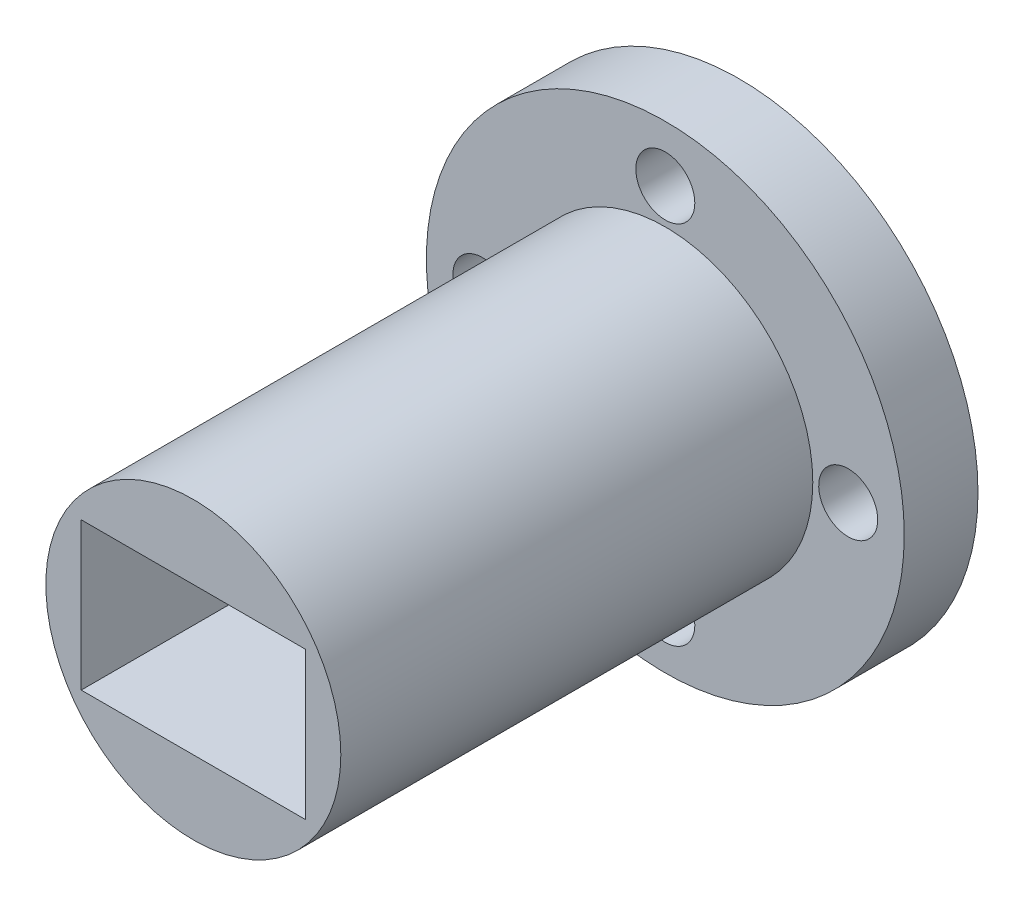
ISO-10303-21;
HEADER;
FILE_DESCRIPTION(('STEP AP214'),'2;1');
FILE_NAME('part.step','',(''),(''),'','','');
FILE_SCHEMA(('AUTOMOTIVE_DESIGN { 1 0 10303 214 1 1 1 1 }'));
ENDSEC;
DATA;
#1=APPLICATION_CONTEXT('core data for automotive mechanical design processes');
#2=APPLICATION_PROTOCOL_DEFINITION('international standard','automotive_design',2000,#1);
#3=PRODUCT_CONTEXT('',#1,'mechanical');
#4=PRODUCT('Part','Part','',(#3));
#5=PRODUCT_RELATED_PRODUCT_CATEGORY('part','',(#4));
#6=PRODUCT_DEFINITION_FORMATION('','',#4);
#7=PRODUCT_DEFINITION_CONTEXT('part definition',#1,'design');
#8=PRODUCT_DEFINITION('design','',#6,#7);
#9=PRODUCT_DEFINITION_SHAPE('','',#8);
#10=(LENGTH_UNIT() NAMED_UNIT(*) SI_UNIT(.MILLI.,.METRE.));
#11=(NAMED_UNIT(*) PLANE_ANGLE_UNIT() SI_UNIT($,.RADIAN.));
#12=(NAMED_UNIT(*) SI_UNIT($,.STERADIAN.) SOLID_ANGLE_UNIT());
#13=UNCERTAINTY_MEASURE_WITH_UNIT(LENGTH_MEASURE(1.E-05),#10,'distance_accuracy_value','');
#14=(GEOMETRIC_REPRESENTATION_CONTEXT(3) GLOBAL_UNCERTAINTY_ASSIGNED_CONTEXT((#13)) GLOBAL_UNIT_ASSIGNED_CONTEXT((#10,
#11,#12)) REPRESENTATION_CONTEXT('',''));
#15=CARTESIAN_POINT('',(0.,0.,0.));
#16=DIRECTION('',(0.,0.,1.));
#17=DIRECTION('',(1.,0.,0.));
#18=AXIS2_PLACEMENT_3D('',#15,#16,#17);
#19=CARTESIAN_POINT('',(0.,0.,3.175));
#20=DIRECTION('',(0.,0.,-1.));
#21=DIRECTION('',(-1.,0.,0.));
#22=AXIS2_PLACEMENT_3D('',#19,#20,#21);
#23=CYLINDRICAL_SURFACE('',#22,10.287);
#24=CARTESIAN_POINT('',(0.,0.,3.175));
#25=DIRECTION('',(0.,0.,1.));
#26=DIRECTION('',(1.,0.,0.));
#27=AXIS2_PLACEMENT_3D('',#24,#25,#26);
#28=CIRCLE('',#27,10.287);
#29=CARTESIAN_POINT('',(10.287,0.,3.175));
#30=VERTEX_POINT('',#29);
#31=EDGE_CURVE('E172',#30,#30,#28,.T.);
#32=ORIENTED_EDGE('',*,*,#31,.F.);
#33=EDGE_LOOP('',(#32));
#34=FACE_BOUND('',#33,.T.);
#35=CARTESIAN_POINT('',(0.,0.,0.));
#36=DIRECTION('',(0.,0.,1.));
#37=DIRECTION('',(1.,0.,0.));
#38=AXIS2_PLACEMENT_3D('',#35,#36,#37);
#39=CIRCLE('',#38,10.287);
#40=CARTESIAN_POINT('',(10.287,0.,0.));
#41=VERTEX_POINT('',#40);
#42=EDGE_CURVE('E171',#41,#41,#39,.T.);
#43=ORIENTED_EDGE('',*,*,#42,.T.);
#44=EDGE_LOOP('',(#43));
#45=FACE_BOUND('',#44,.T.);
#46=ADVANCED_FACE('F39',(#34,#45),#23,.T.);
#47=CARTESIAN_POINT('',(0.,0.,3.175));
#48=DIRECTION('',(0.,0.,1.));
#49=DIRECTION('',(1.,0.,0.));
#50=AXIS2_PLACEMENT_3D('',#47,#48,#49);
#51=PLANE('',#50);
#52=CARTESIAN_POINT('',(0.,0.,3.175));
#53=DIRECTION('',(0.,0.,1.));
#54=DIRECTION('',(1.,0.,0.));
#55=AXIS2_PLACEMENT_3D('',#52,#53,#54);
#56=CIRCLE('',#55,6.35);
#57=CARTESIAN_POINT('',(6.35,0.,3.175));
#58=VERTEX_POINT('',#57);
#59=EDGE_CURVE('E11',#58,#58,#56,.T.);
#60=ORIENTED_EDGE('',*,*,#59,.F.);
#61=EDGE_LOOP('',(#60));
#62=FACE_BOUND('',#61,.T.);
#63=CARTESIAN_POINT('',(7.874,0.,3.175));
#64=DIRECTION('',(0.,0.,1.));
#65=DIRECTION('',(1.,0.,0.));
#66=AXIS2_PLACEMENT_3D('',#63,#64,#65);
#67=CIRCLE('',#66,1.27);
#68=CARTESIAN_POINT('',(9.144,0.,3.175));
#69=VERTEX_POINT('',#68);
#70=EDGE_CURVE('E141',#69,#69,#67,.F.);
#71=ORIENTED_EDGE('',*,*,#70,.T.);
#72=EDGE_LOOP('',(#71));
#73=FACE_BOUND('',#72,.T.);
#74=CARTESIAN_POINT('',(0.,-7.874,3.175));
#75=DIRECTION('',(0.,0.,1.));
#76=DIRECTION('',(1.,0.,0.));
#77=AXIS2_PLACEMENT_3D('',#74,#75,#76);
#78=CIRCLE('',#77,1.27);
#79=CARTESIAN_POINT('',(1.27,-7.874,3.175));
#80=VERTEX_POINT('',#79);
#81=EDGE_CURVE('E149',#80,#80,#78,.F.);
#82=ORIENTED_EDGE('',*,*,#81,.T.);
#83=EDGE_LOOP('',(#82));
#84=FACE_BOUND('',#83,.T.);
#85=CARTESIAN_POINT('',(-7.874,0.,3.175));
#86=DIRECTION('',(0.,0.,1.));
#87=DIRECTION('',(1.,0.,0.));
#88=AXIS2_PLACEMENT_3D('',#85,#86,#87);
#89=CIRCLE('',#88,1.27);
#90=CARTESIAN_POINT('',(-6.604,0.,3.175));
#91=VERTEX_POINT('',#90);
#92=EDGE_CURVE('E134',#91,#91,#89,.F.);
#93=ORIENTED_EDGE('',*,*,#92,.T.);
#94=EDGE_LOOP('',(#93));
#95=FACE_BOUND('',#94,.T.);
#96=CARTESIAN_POINT('',(0.,7.874,3.175));
#97=DIRECTION('',(0.,0.,1.));
#98=DIRECTION('',(1.,0.,0.));
#99=AXIS2_PLACEMENT_3D('',#96,#97,#98);
#100=CIRCLE('',#99,1.27);
#101=CARTESIAN_POINT('',(1.27,7.874,3.175));
#102=VERTEX_POINT('',#101);
#103=EDGE_CURVE('E140',#102,#102,#100,.F.);
#104=ORIENTED_EDGE('',*,*,#103,.T.);
#105=EDGE_LOOP('',(#104));
#106=FACE_BOUND('',#105,.T.);
#107=ORIENTED_EDGE('',*,*,#31,.T.);
#108=EDGE_LOOP('',(#107));
#109=FACE_BOUND('',#108,.T.);
#110=ADVANCED_FACE('F205',(#62,#73,#84,#95,#106,#109),#51,.T.);
#111=CARTESIAN_POINT('',(0.,0.,0.));
#112=DIRECTION('',(0.,0.,1.));
#113=DIRECTION('',(1.,0.,0.));
#114=AXIS2_PLACEMENT_3D('',#111,#112,#113);
#115=PLANE('',#114);
#116=CARTESIAN_POINT('',(7.874,0.,0.));
#117=DIRECTION('',(0.,0.,-1.));
#118=DIRECTION('',(0.,1.,0.));
#119=AXIS2_PLACEMENT_3D('',#116,#117,#118);
#120=CIRCLE('',#119,1.27);
#121=CARTESIAN_POINT('',(7.874,1.26999999999997,0.));
#122=VERTEX_POINT('',#121);
#123=EDGE_CURVE('E136',#122,#122,#120,.T.);
#124=ORIENTED_EDGE('',*,*,#123,.F.);
#125=EDGE_LOOP('',(#124));
#126=FACE_BOUND('',#125,.T.);
#127=CARTESIAN_POINT('',(0.,-7.874,0.));
#128=DIRECTION('',(0.,0.,-1.));
#129=DIRECTION('',(1.,0.,0.));
#130=AXIS2_PLACEMENT_3D('',#127,#128,#129);
#131=CIRCLE('',#130,1.27);
#132=CARTESIAN_POINT('',(1.27,-7.874,0.));
#133=VERTEX_POINT('',#132);
#134=EDGE_CURVE('E145',#133,#133,#131,.T.);
#135=ORIENTED_EDGE('',*,*,#134,.F.);
#136=EDGE_LOOP('',(#135));
#137=FACE_BOUND('',#136,.T.);
#138=CARTESIAN_POINT('',(-7.874,0.,0.));
#139=DIRECTION('',(0.,0.,-1.));
#140=DIRECTION('',(0.,-1.,0.));
#141=AXIS2_PLACEMENT_3D('',#138,#139,#140);
#142=CIRCLE('',#141,1.27);
#143=CARTESIAN_POINT('',(-7.87400000000001,-1.26999999999992,0.));
#144=VERTEX_POINT('',#143);
#145=EDGE_CURVE('E153',#144,#144,#142,.T.);
#146=ORIENTED_EDGE('',*,*,#145,.F.);
#147=EDGE_LOOP('',(#146));
#148=FACE_BOUND('',#147,.T.);
#149=CARTESIAN_POINT('',(0.,7.874,0.));
#150=DIRECTION('',(0.,0.,-1.));
#151=DIRECTION('',(-1.,0.,0.));
#152=AXIS2_PLACEMENT_3D('',#149,#150,#151);
#153=CIRCLE('',#152,1.27);
#154=CARTESIAN_POINT('',(-1.27,7.874,0.));
#155=VERTEX_POINT('',#154);
#156=EDGE_CURVE('E160',#155,#155,#153,.T.);
#157=ORIENTED_EDGE('',*,*,#156,.F.);
#158=EDGE_LOOP('',(#157));
#159=FACE_BOUND('',#158,.T.);
#160=CARTESIAN_POINT('',(0.,0.,0.));
#161=DIRECTION('',(0.,0.,1.));
#162=DIRECTION('',(1.,0.,0.));
#163=AXIS2_PLACEMENT_3D('',#160,#161,#162);
#164=CIRCLE('',#163,5.064000032);
#165=CARTESIAN_POINT('',(5.064000032,0.,0.));
#166=VERTEX_POINT('',#165);
#167=EDGE_CURVE('E43',#166,#166,#164,.T.);
#168=ORIENTED_EDGE('',*,*,#167,.T.);
#169=EDGE_LOOP('',(#168));
#170=FACE_BOUND('',#169,.T.);
#171=ORIENTED_EDGE('',*,*,#42,.F.);
#172=EDGE_LOOP('',(#171));
#173=FACE_BOUND('',#172,.T.);
#174=ADVANCED_FACE('F187',(#126,#137,#148,#159,#170,#173),#115,.F.);
#175=CARTESIAN_POINT('',(0.,0.,2.38125));
#176=DIRECTION('',(0.,0.,-1.));
#177=DIRECTION('',(-1.,0.,0.));
#178=AXIS2_PLACEMENT_3D('',#175,#176,#177);
#179=CYLINDRICAL_SURFACE('',#178,4.064);
#180=CARTESIAN_POINT('',(0.,0.,1.000000032));
#181=DIRECTION('',(0.,0.,1.));
#182=DIRECTION('',(1.,0.,0.));
#183=AXIS2_PLACEMENT_3D('',#180,#181,#182);
#184=CIRCLE('',#183,4.064);
#185=CARTESIAN_POINT('',(-4.064,0.,1.000000032));
#186=VERTEX_POINT('',#185);
#187=EDGE_CURVE('E176',#186,#186,#184,.F.);
#188=CARTESIAN_POINT('',(0.,0.,2.38125));
#189=DIRECTION('',(0.,0.,-1.));
#190=DIRECTION('',(-1.,0.,0.));
#191=AXIS2_PLACEMENT_3D('',#188,#189,#190);
#192=CIRCLE('',#191,4.064);
#193=CARTESIAN_POINT('',(-4.064,0.,2.38125));
#194=VERTEX_POINT('',#193);
#195=EDGE_CURVE('E164',#194,#194,#192,.T.);
#196=CARTESIAN_POINT('',(-4.064,0.,1.000000032));
#197=CARTESIAN_POINT('',(-4.064,0.,1.0143880525));
#198=CARTESIAN_POINT('',(-4.064,0.,1.028776073));
#199=CARTESIAN_POINT('',(-4.064,0.,1.057552114));
#200=CARTESIAN_POINT('',(-4.064,0.,1.0719401345));
#201=CARTESIAN_POINT('',(-4.064,0.,1.1007161755));
#202=CARTESIAN_POINT('',(-4.064,0.,1.115104196));
#203=CARTESIAN_POINT('',(-4.064,0.,1.143880237));
#204=CARTESIAN_POINT('',(-4.064,0.,1.1582682575));
#205=CARTESIAN_POINT('',(-4.064,0.,1.1870442985));
#206=CARTESIAN_POINT('',(-4.064,0.,1.201432319));
#207=CARTESIAN_POINT('',(-4.064,0.,1.23020836));
#208=CARTESIAN_POINT('',(-4.064,0.,1.2445963805));
#209=CARTESIAN_POINT('',(-4.064,0.,1.2733724215));
#210=CARTESIAN_POINT('',(-4.064,0.,1.287760442));
#211=CARTESIAN_POINT('',(-4.064,0.,1.316536483));
#212=CARTESIAN_POINT('',(-4.064,0.,1.3309245035));
#213=CARTESIAN_POINT('',(-4.064,0.,1.3597005445));
#214=CARTESIAN_POINT('',(-4.064,0.,1.374088565));
#215=CARTESIAN_POINT('',(-4.064,0.,1.402864606));
#216=CARTESIAN_POINT('',(-4.064,0.,1.4172526265));
#217=CARTESIAN_POINT('',(-4.064,0.,1.4460286675));
#218=CARTESIAN_POINT('',(-4.064,0.,1.460416688));
#219=CARTESIAN_POINT('',(-4.064,0.,1.489192729));
#220=CARTESIAN_POINT('',(-4.064,0.,1.5035807495));
#221=CARTESIAN_POINT('',(-4.064,0.,1.5323567905));
#222=CARTESIAN_POINT('',(-4.064,0.,1.546744811));
#223=CARTESIAN_POINT('',(-4.064,0.,1.575520852));
#224=CARTESIAN_POINT('',(-4.064,0.,1.5899088725));
#225=CARTESIAN_POINT('',(-4.064,0.,1.6186849135));
#226=CARTESIAN_POINT('',(-4.064,0.,1.633072934));
#227=CARTESIAN_POINT('',(-4.064,0.,1.661848975));
#228=CARTESIAN_POINT('',(-4.064,0.,1.6762369955));
#229=CARTESIAN_POINT('',(-4.064,0.,1.7050130365));
#230=CARTESIAN_POINT('',(-4.064,0.,1.719401057));
#231=CARTESIAN_POINT('',(-4.064,0.,1.748177098));
#232=CARTESIAN_POINT('',(-4.064,0.,1.7625651185));
#233=CARTESIAN_POINT('',(-4.064,0.,1.7913411595));
#234=CARTESIAN_POINT('',(-4.064,0.,1.80572918));
#235=CARTESIAN_POINT('',(-4.064,0.,1.834505221));
#236=CARTESIAN_POINT('',(-4.064,0.,1.8488932415));
#237=CARTESIAN_POINT('',(-4.064,0.,1.8776692825));
#238=CARTESIAN_POINT('',(-4.064,0.,1.892057303));
#239=CARTESIAN_POINT('',(-4.064,0.,1.920833344));
#240=CARTESIAN_POINT('',(-4.064,0.,1.9352213645));
#241=CARTESIAN_POINT('',(-4.064,0.,1.9639974055));
#242=CARTESIAN_POINT('',(-4.064,0.,1.978385426));
#243=CARTESIAN_POINT('',(-4.064,0.,2.007161467));
#244=CARTESIAN_POINT('',(-4.064,0.,2.0215494875));
#245=CARTESIAN_POINT('',(-4.064,0.,2.0503255285));
#246=CARTESIAN_POINT('',(-4.064,0.,2.064713549));
#247=CARTESIAN_POINT('',(-4.064,0.,2.09348959));
#248=CARTESIAN_POINT('',(-4.064,0.,2.1078776105));
#249=CARTESIAN_POINT('',(-4.064,0.,2.1366536515));
#250=CARTESIAN_POINT('',(-4.064,0.,2.151041672));
#251=CARTESIAN_POINT('',(-4.064,0.,2.179817713));
#252=CARTESIAN_POINT('',(-4.064,0.,2.1942057335));
#253=CARTESIAN_POINT('',(-4.064,0.,2.2229817745));
#254=CARTESIAN_POINT('',(-4.064,0.,2.237369795));
#255=CARTESIAN_POINT('',(-4.064,0.,2.266145836));
#256=CARTESIAN_POINT('',(-4.064,0.,2.2805338565));
#257=CARTESIAN_POINT('',(-4.064,0.,2.3093098975));
#258=CARTESIAN_POINT('',(-4.064,0.,2.323697918));
#259=CARTESIAN_POINT('',(-4.064,0.,2.352473959));
#260=CARTESIAN_POINT('',(-4.064,0.,2.3668619795));
#261=CARTESIAN_POINT('',(-4.064,0.,2.38125));
#262=B_SPLINE_CURVE_WITH_KNOTS('',3,(#196,#197,#198,#199,#200,#201,#202,#203,#204,#205,#206,
#207,#208,#209,#210,#211,#212,#213,#214,#215,#216,#217,#218,#219,#220,#221,#222,#223,#224,#225,
#226,#227,#228,#229,#230,#231,#232,#233,#234,#235,#236,#237,#238,#239,#240,#241,#242,#243,#244,
#245,#246,#247,#248,#249,#250,#251,#252,#253,#254,#255,#256,#257,#258,#259,#260,#261),
.UNSPECIFIED.,.F.,.F.,(4,2,2,2,2,2,2,2,2,2,2,2,2,2,2,2,2,2,2,2,2,2,2,2,2,2,2,2,2,2,2,2,4),(0.,
0.0431640615,0.086328123,0.1294921845,0.172656246,0.2158203075,0.258984369,0.3021484305,
0.345312492,0.3884765535,0.431640615,0.4748046765,0.517968738,0.5611327995,0.604296861,
0.6474609225,0.690624984,0.7337890455,0.776953107,0.8201171685,0.86328123,0.9064452915,
0.949609353,0.9927734145,1.035937476,1.0791015375,1.122265599,1.1654296605,1.208593722,
1.2517577835,1.294921845,1.3380859065,1.381249968),.UNSPECIFIED.);
#263=EDGE_CURVE('BSEAM201',#186,#194,#262,.T.);
#264=ORIENTED_EDGE('',*,*,#187,.T.);
#265=ORIENTED_EDGE('',*,*,#195,.F.);
#266=ORIENTED_EDGE('',*,*,#263,.T.);
#267=ORIENTED_EDGE('',*,*,#263,.F.);
#268=EDGE_LOOP('',(#264,#266,#265,#267));
#269=FACE_BOUND('',#268,.T.);
#270=ADVANCED_FACE('F201',(#269),#179,.F.);
#271=CARTESIAN_POINT('',(0.,0.,2.38125));
#272=DIRECTION('',(0.,0.,-1.));
#273=DIRECTION('',(-1.,0.,0.));
#274=AXIS2_PLACEMENT_3D('',#271,#272,#273);
#275=PLANE('',#274);
#276=ORIENTED_EDGE('',*,*,#195,.T.);
#277=EDGE_LOOP('',(#276));
#278=FACE_BOUND('',#277,.T.);
#279=ADVANCED_FACE('F193',(#278),#275,.T.);
#280=CARTESIAN_POINT('',(0.,0.,1.000000032));
#281=DIRECTION('',(0.,0.,1.));
#282=DIRECTION('',(1.,0.,0.));
#283=AXIS2_PLACEMENT_3D('',#280,#281,#282);
#284=TOROIDAL_SURFACE('',#283,5.064000032,1.000000032);
#285=ORIENTED_EDGE('',*,*,#167,.F.);
#286=EDGE_LOOP('',(#285));
#287=FACE_BOUND('',#286,.T.);
#288=ORIENTED_EDGE('',*,*,#187,.F.);
#289=EDGE_LOOP('',(#288));
#290=FACE_BOUND('',#289,.T.);
#291=ADVANCED_FACE('F41',(#287,#290),#284,.T.);
#292=CARTESIAN_POINT('',(0.,7.874,3.176));
#293=DIRECTION('',(0.,0.,-1.));
#294=DIRECTION('',(-1.,0.,0.));
#295=AXIS2_PLACEMENT_3D('',#292,#293,#294);
#296=CYLINDRICAL_SURFACE('',#295,1.27);
#297=ORIENTED_EDGE('',*,*,#103,.F.);
#298=EDGE_LOOP('',(#297));
#299=FACE_BOUND('',#298,.T.);
#300=ORIENTED_EDGE('',*,*,#156,.T.);
#301=EDGE_LOOP('',(#300));
#302=FACE_BOUND('',#301,.T.);
#303=ADVANCED_FACE('F192',(#299,#302),#296,.F.);
#304=CARTESIAN_POINT('',(-7.874,0.,3.176));
#305=DIRECTION('',(0.,0.,-1.));
#306=DIRECTION('',(-1.,0.,0.));
#307=AXIS2_PLACEMENT_3D('',#304,#305,#306);
#308=CYLINDRICAL_SURFACE('',#307,1.27);
#309=ORIENTED_EDGE('',*,*,#92,.F.);
#310=EDGE_LOOP('',(#309));
#311=FACE_BOUND('',#310,.T.);
#312=ORIENTED_EDGE('',*,*,#145,.T.);
#313=EDGE_LOOP('',(#312));
#314=FACE_BOUND('',#313,.T.);
#315=ADVANCED_FACE('F198',(#311,#314),#308,.F.);
#316=CARTESIAN_POINT('',(0.,-7.874,3.176));
#317=DIRECTION('',(0.,0.,-1.));
#318=DIRECTION('',(-1.,0.,0.));
#319=AXIS2_PLACEMENT_3D('',#316,#317,#318);
#320=CYLINDRICAL_SURFACE('',#319,1.27);
#321=ORIENTED_EDGE('',*,*,#81,.F.);
#322=EDGE_LOOP('',(#321));
#323=FACE_BOUND('',#322,.T.);
#324=ORIENTED_EDGE('',*,*,#134,.T.);
#325=EDGE_LOOP('',(#324));
#326=FACE_BOUND('',#325,.T.);
#327=ADVANCED_FACE('F222',(#323,#326),#320,.F.);
#328=CARTESIAN_POINT('',(7.874,0.,3.176));
#329=DIRECTION('',(0.,0.,-1.));
#330=DIRECTION('',(-1.,0.,0.));
#331=AXIS2_PLACEMENT_3D('',#328,#329,#330);
#332=CYLINDRICAL_SURFACE('',#331,1.27);
#333=ORIENTED_EDGE('',*,*,#70,.F.);
#334=EDGE_LOOP('',(#333));
#335=FACE_BOUND('',#334,.T.);
#336=ORIENTED_EDGE('',*,*,#123,.T.);
#337=EDGE_LOOP('',(#336));
#338=FACE_BOUND('',#337,.T.);
#339=ADVANCED_FACE('F226',(#335,#338),#332,.F.);
#340=CARTESIAN_POINT('',(0.,0.,23.495));
#341=DIRECTION('',(0.,0.,-1.));
#342=DIRECTION('',(-1.,0.,0.));
#343=AXIS2_PLACEMENT_3D('',#340,#341,#342);
#344=CYLINDRICAL_SURFACE('',#343,6.35);
#345=CARTESIAN_POINT('',(0.,0.,23.495));
#346=DIRECTION('',(0.,0.,1.));
#347=DIRECTION('',(1.,0.,0.));
#348=AXIS2_PLACEMENT_3D('',#345,#346,#347);
#349=CIRCLE('',#348,6.35);
#350=CARTESIAN_POINT('',(6.35,0.,23.495));
#351=VERTEX_POINT('',#350);
#352=EDGE_CURVE('E127',#351,#351,#349,.T.);
#353=ORIENTED_EDGE('',*,*,#352,.F.);
#354=EDGE_LOOP('',(#353));
#355=FACE_BOUND('',#354,.T.);
#356=ORIENTED_EDGE('',*,*,#59,.T.);
#357=EDGE_LOOP('',(#356));
#358=FACE_BOUND('',#357,.T.);
#359=ADVANCED_FACE('F230',(#355,#358),#344,.T.);
#360=CARTESIAN_POINT('',(0.,0.,23.495));
#361=DIRECTION('',(0.,0.,1.));
#362=DIRECTION('',(1.,0.,0.));
#363=AXIS2_PLACEMENT_3D('',#360,#361,#362);
#364=PLANE('',#363);
#365=DIRECTION('',(0.,-1.,0.));
#366=VECTOR('',#365,1.);
#367=CARTESIAN_POINT('',(-4.826,-3.175,23.495));
#368=LINE('',#367,#366);
#369=CARTESIAN_POINT('',(-4.826,3.175,23.495));
#370=VERTEX_POINT('',#369);
#371=CARTESIAN_POINT('',(-4.826,-3.175,23.495));
#372=VERTEX_POINT('',#371);
#373=EDGE_CURVE('E56',#370,#372,#368,.T.);
#374=ORIENTED_EDGE('',*,*,#373,.F.);
#375=DIRECTION('',(-1.,0.,0.));
#376=VECTOR('',#375,1.);
#377=CARTESIAN_POINT('',(4.826,3.175,23.495));
#378=LINE('',#377,#376);
#379=CARTESIAN_POINT('',(4.826,3.175,23.495));
#380=VERTEX_POINT('',#379);
#381=EDGE_CURVE('E111',#380,#370,#378,.T.);
#382=ORIENTED_EDGE('',*,*,#381,.F.);
#383=DIRECTION('',(0.,1.,0.));
#384=VECTOR('',#383,1.);
#385=CARTESIAN_POINT('',(4.826,-3.175,23.495));
#386=LINE('',#385,#384);
#387=CARTESIAN_POINT('',(4.826,-3.175,23.495));
#388=VERTEX_POINT('',#387);
#389=EDGE_CURVE('E120',#388,#380,#386,.T.);
#390=ORIENTED_EDGE('',*,*,#389,.F.);
#391=DIRECTION('',(1.,0.,0.));
#392=VECTOR('',#391,1.);
#393=CARTESIAN_POINT('',(4.826,-3.175,23.495));
#394=LINE('',#393,#392);
#395=EDGE_CURVE('E91',#372,#388,#394,.T.);
#396=ORIENTED_EDGE('',*,*,#395,.F.);
#397=EDGE_LOOP('',(#374,#382,#390,#396));
#398=FACE_BOUND('',#397,.T.);
#399=ORIENTED_EDGE('',*,*,#352,.T.);
#400=EDGE_LOOP('',(#399));
#401=FACE_BOUND('',#400,.T.);
#402=ADVANCED_FACE('F234',(#398,#401),#364,.T.);
#403=CARTESIAN_POINT('',(-4.826,-3.175,4.445));
#404=DIRECTION('',(-1.,0.,0.));
#405=DIRECTION('',(0.,0.,1.));
#406=AXIS2_PLACEMENT_3D('',#403,#404,#405);
#407=PLANE('',#406);
#408=ORIENTED_EDGE('',*,*,#373,.T.);
#409=DIRECTION('',(0.,0.,1.));
#410=VECTOR('',#409,1.);
#411=CARTESIAN_POINT('',(-4.826,-3.175,4.445));
#412=LINE('',#411,#410);
#413=CARTESIAN_POINT('',(-4.826,-3.175,4.445));
#414=VERTEX_POINT('',#413);
#415=EDGE_CURVE('E79',#414,#372,#412,.T.);
#416=ORIENTED_EDGE('',*,*,#415,.F.);
#417=DIRECTION('',(0.,-1.,0.));
#418=VECTOR('',#417,1.);
#419=CARTESIAN_POINT('',(-4.826,-3.175,4.445));
#420=LINE('',#419,#418);
#421=CARTESIAN_POINT('',(-4.826,3.175,4.445));
#422=VERTEX_POINT('',#421);
#423=EDGE_CURVE('E107',#422,#414,#420,.T.);
#424=ORIENTED_EDGE('',*,*,#423,.F.);
#425=DIRECTION('',(0.,0.,1.));
#426=VECTOR('',#425,1.);
#427=CARTESIAN_POINT('',(-4.826,3.175,4.445));
#428=LINE('',#427,#426);
#429=EDGE_CURVE('E64',#422,#370,#428,.T.);
#430=ORIENTED_EDGE('',*,*,#429,.T.);
#431=EDGE_LOOP('',(#408,#416,#424,#430));
#432=FACE_BOUND('',#431,.T.);
#433=ADVANCED_FACE('F238',(#432),#407,.F.);
#434=CARTESIAN_POINT('',(4.826,3.175,4.445));
#435=DIRECTION('',(0.,1.,0.));
#436=DIRECTION('',(-1.,0.,0.));
#437=AXIS2_PLACEMENT_3D('',#434,#435,#436);
#438=PLANE('',#437);
#439=ORIENTED_EDGE('',*,*,#381,.T.);
#440=ORIENTED_EDGE('',*,*,#429,.F.);
#441=DIRECTION('',(-1.,0.,0.));
#442=VECTOR('',#441,1.);
#443=CARTESIAN_POINT('',(4.826,3.175,4.445));
#444=LINE('',#443,#442);
#445=CARTESIAN_POINT('',(4.826,3.175,4.445));
#446=VERTEX_POINT('',#445);
#447=EDGE_CURVE('E104',#446,#422,#444,.T.);
#448=ORIENTED_EDGE('',*,*,#447,.F.);
#449=DIRECTION('',(0.,0.,1.));
#450=VECTOR('',#449,1.);
#451=CARTESIAN_POINT('',(4.826,3.175,4.445));
#452=LINE('',#451,#450);
#453=EDGE_CURVE('E96',#446,#380,#452,.T.);
#454=ORIENTED_EDGE('',*,*,#453,.T.);
#455=EDGE_LOOP('',(#439,#440,#448,#454));
#456=FACE_BOUND('',#455,.T.);
#457=ADVANCED_FACE('F242',(#456),#438,.F.);
#458=CARTESIAN_POINT('',(4.826,-3.175,4.445));
#459=DIRECTION('',(1.,0.,0.));
#460=DIRECTION('',(0.,0.,-1.));
#461=AXIS2_PLACEMENT_3D('',#458,#459,#460);
#462=PLANE('',#461);
#463=ORIENTED_EDGE('',*,*,#389,.T.);
#464=ORIENTED_EDGE('',*,*,#453,.F.);
#465=DIRECTION('',(0.,1.,0.));
#466=VECTOR('',#465,1.);
#467=CARTESIAN_POINT('',(4.826,-3.175,4.445));
#468=LINE('',#467,#466);
#469=CARTESIAN_POINT('',(4.826,-3.175,4.445));
#470=VERTEX_POINT('',#469);
#471=EDGE_CURVE('E99',#470,#446,#468,.T.);
#472=ORIENTED_EDGE('',*,*,#471,.F.);
#473=DIRECTION('',(0.,0.,1.));
#474=VECTOR('',#473,1.);
#475=CARTESIAN_POINT('',(4.826,-3.175,4.445));
#476=LINE('',#475,#474);
#477=EDGE_CURVE('E84',#470,#388,#476,.T.);
#478=ORIENTED_EDGE('',*,*,#477,.T.);
#479=EDGE_LOOP('',(#463,#464,#472,#478));
#480=FACE_BOUND('',#479,.T.);
#481=ADVANCED_FACE('F100',(#480),#462,.F.);
#482=CARTESIAN_POINT('',(4.826,-3.175,4.445));
#483=DIRECTION('',(0.,-1.,0.));
#484=DIRECTION('',(1.,0.,0.));
#485=AXIS2_PLACEMENT_3D('',#482,#483,#484);
#486=PLANE('',#485);
#487=ORIENTED_EDGE('',*,*,#395,.T.);
#488=ORIENTED_EDGE('',*,*,#477,.F.);
#489=DIRECTION('',(1.,0.,0.));
#490=VECTOR('',#489,1.);
#491=CARTESIAN_POINT('',(4.826,-3.175,4.445));
#492=LINE('',#491,#490);
#493=EDGE_CURVE('E88',#414,#470,#492,.T.);
#494=ORIENTED_EDGE('',*,*,#493,.F.);
#495=ORIENTED_EDGE('',*,*,#415,.T.);
#496=EDGE_LOOP('',(#487,#488,#494,#495));
#497=FACE_BOUND('',#496,.T.);
#498=ADVANCED_FACE('F86',(#497),#486,.F.);
#499=CARTESIAN_POINT('',(0.,0.,4.445));
#500=DIRECTION('',(0.,0.,1.));
#501=DIRECTION('',(1.,0.,0.));
#502=AXIS2_PLACEMENT_3D('',#499,#500,#501);
#503=PLANE('',#502);
#504=ORIENTED_EDGE('',*,*,#423,.T.);
#505=ORIENTED_EDGE('',*,*,#493,.T.);
#506=ORIENTED_EDGE('',*,*,#471,.T.);
#507=ORIENTED_EDGE('',*,*,#447,.T.);
#508=EDGE_LOOP('',(#504,#505,#506,#507));
#509=FACE_BOUND('',#508,.T.);
#510=ADVANCED_FACE('F106',(#509),#503,.T.);
#511=CLOSED_SHELL('',(#46,#110,#174,#270,#279,#291,#303,#315,#327,#339,#359,#402,#433,#457,#481,
#498,#510));
#512=MANIFOLD_SOLID_BREP('B2',#511);
#513=ADVANCED_BREP_SHAPE_REPRESENTATION('',(#18,#512),#14);
#514=SHAPE_DEFINITION_REPRESENTATION(#9,#513);
ENDSEC;
END-ISO-10303-21;
